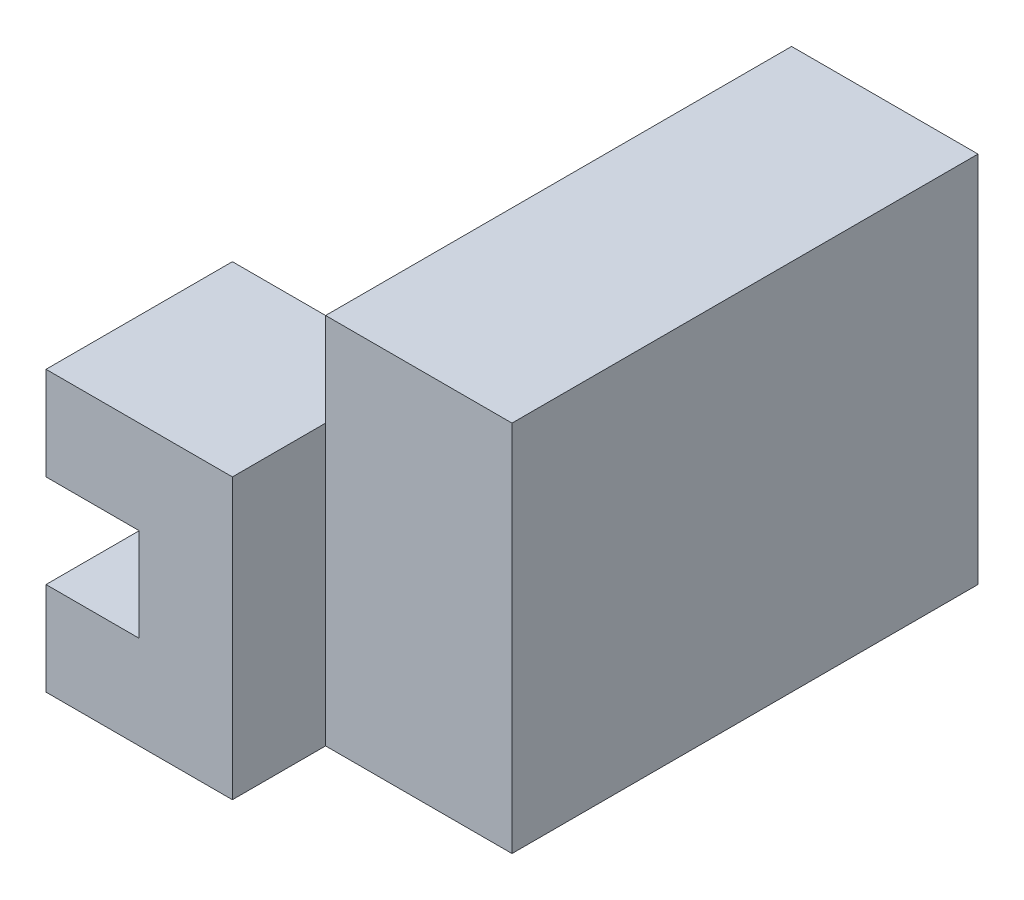
ISO-10303-21;
HEADER;
FILE_DESCRIPTION(('STEP AP214'),'2;1');
FILE_NAME('part.step','',(''),(''),'','','');
FILE_SCHEMA(('AUTOMOTIVE_DESIGN { 1 0 10303 214 1 1 1 1 }'));
ENDSEC;
DATA;
#1=APPLICATION_CONTEXT('core data for automotive mechanical design processes');
#2=APPLICATION_PROTOCOL_DEFINITION('international standard','automotive_design',2000,#1);
#3=PRODUCT_CONTEXT('',#1,'mechanical');
#4=PRODUCT('Part','Part','',(#3));
#5=PRODUCT_RELATED_PRODUCT_CATEGORY('part','',(#4));
#6=PRODUCT_DEFINITION_FORMATION('','',#4);
#7=PRODUCT_DEFINITION_CONTEXT('part definition',#1,'design');
#8=PRODUCT_DEFINITION('design','',#6,#7);
#9=PRODUCT_DEFINITION_SHAPE('','',#8);
#10=(LENGTH_UNIT() NAMED_UNIT(*) SI_UNIT(.MILLI.,.METRE.));
#11=(NAMED_UNIT(*) PLANE_ANGLE_UNIT() SI_UNIT($,.RADIAN.));
#12=(NAMED_UNIT(*) SI_UNIT($,.STERADIAN.) SOLID_ANGLE_UNIT());
#13=UNCERTAINTY_MEASURE_WITH_UNIT(LENGTH_MEASURE(1.E-05),#10,'distance_accuracy_value','');
#14=(GEOMETRIC_REPRESENTATION_CONTEXT(3) GLOBAL_UNCERTAINTY_ASSIGNED_CONTEXT((#13)) GLOBAL_UNIT_ASSIGNED_CONTEXT((#10,
#11,#12)) REPRESENTATION_CONTEXT('',''));
#15=CARTESIAN_POINT('',(0.,0.,0.));
#16=DIRECTION('',(0.,0.,1.));
#17=DIRECTION('',(1.,0.,0.));
#18=AXIS2_PLACEMENT_3D('',#15,#16,#17);
#19=CARTESIAN_POINT('',(0.,4.,5.));
#20=DIRECTION('',(1.,0.,0.));
#21=DIRECTION('',(0.,0.,-1.));
#22=AXIS2_PLACEMENT_3D('',#19,#20,#21);
#23=PLANE('',#22);
#24=DIRECTION('',(0.,0.,-1.));
#25=VECTOR('',#24,1.);
#26=CARTESIAN_POINT('',(0.,3.,6.));
#27=LINE('',#26,#25);
#28=CARTESIAN_POINT('',(0.,3.,5.));
#29=VERTEX_POINT('',#28);
#30=CARTESIAN_POINT('',(0.,3.,4.));
#31=VERTEX_POINT('',#30);
#32=EDGE_CURVE('E180',#29,#31,#27,.T.);
#33=ORIENTED_EDGE('',*,*,#32,.F.);
#34=DIRECTION('',(0.,-1.,0.));
#35=VECTOR('',#34,1.);
#36=CARTESIAN_POINT('',(0.,4.,5.));
#37=LINE('',#36,#35);
#38=CARTESIAN_POINT('',(0.,4.,5.));
#39=VERTEX_POINT('',#38);
#40=EDGE_CURVE('E194',#39,#29,#37,.T.);
#41=ORIENTED_EDGE('',*,*,#40,.F.);
#42=DIRECTION('',(0.,0.,-1.));
#43=VECTOR('',#42,1.);
#44=CARTESIAN_POINT('',(0.,4.,5.));
#45=LINE('',#44,#43);
#46=CARTESIAN_POINT('',(0.,4.,0.));
#47=VERTEX_POINT('',#46);
#48=EDGE_CURVE('E203',#39,#47,#45,.T.);
#49=ORIENTED_EDGE('',*,*,#48,.T.);
#50=DIRECTION('',(0.,-1.,0.));
#51=VECTOR('',#50,1.);
#52=CARTESIAN_POINT('',(0.,4.,0.));
#53=LINE('',#52,#51);
#54=CARTESIAN_POINT('',(0.,1.,0.));
#55=VERTEX_POINT('',#54);
#56=EDGE_CURVE('E193',#47,#55,#53,.T.);
#57=ORIENTED_EDGE('',*,*,#56,.T.);
#58=DIRECTION('',(0.,0.,1.));
#59=VECTOR('',#58,1.);
#60=CARTESIAN_POINT('',(0.,1.,0.));
#61=LINE('',#60,#59);
#62=CARTESIAN_POINT('',(0.,1.,4.));
#63=VERTEX_POINT('',#62);
#64=EDGE_CURVE('E135',#55,#63,#61,.T.);
#65=ORIENTED_EDGE('',*,*,#64,.T.);
#66=DIRECTION('',(0.,1.,0.));
#67=VECTOR('',#66,1.);
#68=CARTESIAN_POINT('',(0.,3.,4.));
#69=LINE('',#68,#67);
#70=EDGE_CURVE('E47',#63,#31,#69,.T.);
#71=ORIENTED_EDGE('',*,*,#70,.T.);
#72=EDGE_LOOP('',(#33,#41,#49,#57,#65,#71));
#73=FACE_BOUND('',#72,.T.);
#74=ADVANCED_FACE('F33',(#73),#23,.F.);
#75=CARTESIAN_POINT('',(0.,0.,5.));
#76=DIRECTION('',(0.,0.,1.));
#77=DIRECTION('',(1.,0.,0.));
#78=AXIS2_PLACEMENT_3D('',#75,#76,#77);
#79=PLANE('',#78);
#80=DIRECTION('',(0.,-1.,0.));
#81=VECTOR('',#80,1.);
#82=CARTESIAN_POINT('',(0.,0.,5.));
#83=LINE('',#82,#81);
#84=CARTESIAN_POINT('',(0.,0.,5.));
#85=VERTEX_POINT('',#84);
#86=EDGE_CURVE('E55',#29,#85,#83,.T.);
#87=ORIENTED_EDGE('',*,*,#86,.T.);
#88=DIRECTION('',(1.,0.,0.));
#89=VECTOR('',#88,1.);
#90=CARTESIAN_POINT('',(0.,0.,5.));
#91=LINE('',#90,#89);
#92=CARTESIAN_POINT('',(2.,0.,5.));
#93=VERTEX_POINT('',#92);
#94=EDGE_CURVE('E196',#85,#93,#91,.T.);
#95=ORIENTED_EDGE('',*,*,#94,.T.);
#96=DIRECTION('',(0.,1.,0.));
#97=VECTOR('',#96,1.);
#98=CARTESIAN_POINT('',(2.,0.,5.));
#99=LINE('',#98,#97);
#100=CARTESIAN_POINT('',(2.,4.,5.));
#101=VERTEX_POINT('',#100);
#102=EDGE_CURVE('E199',#93,#101,#99,.T.);
#103=ORIENTED_EDGE('',*,*,#102,.T.);
#104=DIRECTION('',(-1.,0.,0.));
#105=VECTOR('',#104,1.);
#106=CARTESIAN_POINT('',(2.,4.,5.));
#107=LINE('',#106,#105);
#108=EDGE_CURVE('E201',#101,#39,#107,.T.);
#109=ORIENTED_EDGE('',*,*,#108,.T.);
#110=ORIENTED_EDGE('',*,*,#40,.T.);
#111=EDGE_LOOP('',(#87,#95,#103,#109,#110));
#112=FACE_BOUND('',#111,.T.);
#113=ADVANCED_FACE('F241',(#112),#79,.T.);
#114=CARTESIAN_POINT('',(0.,1.,0.));
#115=DIRECTION('',(0.,-1.,0.));
#116=DIRECTION('',(0.,0.,-1.));
#117=AXIS2_PLACEMENT_3D('',#114,#115,#116);
#118=PLANE('',#117);
#119=DIRECTION('',(-1.,0.,0.));
#120=VECTOR('',#119,1.);
#121=CARTESIAN_POINT('',(0.,1.,4.));
#122=LINE('',#121,#120);
#123=CARTESIAN_POINT('',(-1.,1.,4.));
#124=VERTEX_POINT('',#123);
#125=EDGE_CURVE('E40',#63,#124,#122,.T.);
#126=ORIENTED_EDGE('',*,*,#125,.F.);
#127=ORIENTED_EDGE('',*,*,#64,.F.);
#128=DIRECTION('',(1.,0.,0.));
#129=VECTOR('',#128,1.);
#130=CARTESIAN_POINT('',(0.,1.,0.));
#131=LINE('',#130,#129);
#132=CARTESIAN_POINT('',(-2.,1.,0.));
#133=VERTEX_POINT('',#132);
#134=EDGE_CURVE('E131',#133,#55,#131,.T.);
#135=ORIENTED_EDGE('',*,*,#134,.F.);
#136=DIRECTION('',(0.,0.,-1.));
#137=VECTOR('',#136,1.);
#138=CARTESIAN_POINT('',(-2.,1.,0.));
#139=LINE('',#138,#137);
#140=CARTESIAN_POINT('',(-2.,1.,6.));
#141=VERTEX_POINT('',#140);
#142=EDGE_CURVE('E125',#141,#133,#139,.T.);
#143=ORIENTED_EDGE('',*,*,#142,.F.);
#144=DIRECTION('',(-1.,0.,0.));
#145=VECTOR('',#144,1.);
#146=CARTESIAN_POINT('',(-2.,1.,6.));
#147=LINE('',#146,#145);
#148=CARTESIAN_POINT('',(-1.,1.,6.));
#149=VERTEX_POINT('',#148);
#150=EDGE_CURVE('E129',#149,#141,#147,.T.);
#151=ORIENTED_EDGE('',*,*,#150,.F.);
#152=DIRECTION('',(0.,0.,1.));
#153=VECTOR('',#152,1.);
#154=CARTESIAN_POINT('',(-1.,1.,0.));
#155=LINE('',#154,#153);
#156=EDGE_CURVE('E11',#124,#149,#155,.T.);
#157=ORIENTED_EDGE('',*,*,#156,.F.);
#158=EDGE_LOOP('',(#126,#127,#135,#143,#151,#157));
#159=FACE_BOUND('',#158,.T.);
#160=ADVANCED_FACE('F127',(#159),#118,.F.);
#161=CARTESIAN_POINT('',(0.,0.,5.));
#162=DIRECTION('',(0.,1.,0.));
#163=DIRECTION('',(0.,0.,1.));
#164=AXIS2_PLACEMENT_3D('',#161,#162,#163);
#165=PLANE('',#164);
#166=ORIENTED_EDGE('',*,*,#94,.F.);
#167=DIRECTION('',(0.,0.,-1.));
#168=VECTOR('',#167,1.);
#169=CARTESIAN_POINT('',(0.,0.,6.));
#170=LINE('',#169,#168);
#171=CARTESIAN_POINT('',(0.,0.,6.));
#172=VERTEX_POINT('',#171);
#173=EDGE_CURVE('E184',#172,#85,#170,.T.);
#174=ORIENTED_EDGE('',*,*,#173,.F.);
#175=DIRECTION('',(1.,0.,0.));
#176=VECTOR('',#175,1.);
#177=CARTESIAN_POINT('',(0.,0.,6.));
#178=LINE('',#177,#176);
#179=CARTESIAN_POINT('',(-2.,0.,6.));
#180=VERTEX_POINT('',#179);
#181=EDGE_CURVE('E143',#180,#172,#178,.T.);
#182=ORIENTED_EDGE('',*,*,#181,.F.);
#183=DIRECTION('',(0.,0.,-1.));
#184=VECTOR('',#183,1.);
#185=CARTESIAN_POINT('',(-2.,0.,0.));
#186=LINE('',#185,#184);
#187=CARTESIAN_POINT('',(-2.,0.,0.));
#188=VERTEX_POINT('',#187);
#189=EDGE_CURVE('E140',#180,#188,#186,.T.);
#190=ORIENTED_EDGE('',*,*,#189,.T.);
#191=DIRECTION('',(1.,0.,0.));
#192=VECTOR('',#191,1.);
#193=CARTESIAN_POINT('',(0.,0.,0.));
#194=LINE('',#193,#192);
#195=CARTESIAN_POINT('',(2.,0.,0.));
#196=VERTEX_POINT('',#195);
#197=EDGE_CURVE('E206',#188,#196,#194,.T.);
#198=ORIENTED_EDGE('',*,*,#197,.T.);
#199=DIRECTION('',(0.,0.,-1.));
#200=VECTOR('',#199,1.);
#201=CARTESIAN_POINT('',(2.,0.,5.));
#202=LINE('',#201,#200);
#203=EDGE_CURVE('E216',#93,#196,#202,.T.);
#204=ORIENTED_EDGE('',*,*,#203,.F.);
#205=EDGE_LOOP('',(#166,#174,#182,#190,#198,#204));
#206=FACE_BOUND('',#205,.T.);
#207=ADVANCED_FACE('F249',(#206),#165,.F.);
#208=CARTESIAN_POINT('',(2.,0.,5.));
#209=DIRECTION('',(-1.,0.,0.));
#210=DIRECTION('',(0.,0.,1.));
#211=AXIS2_PLACEMENT_3D('',#208,#209,#210);
#212=PLANE('',#211);
#213=DIRECTION('',(0.,1.,0.));
#214=VECTOR('',#213,1.);
#215=CARTESIAN_POINT('',(2.,0.,0.));
#216=LINE('',#215,#214);
#217=CARTESIAN_POINT('',(2.,4.,0.));
#218=VERTEX_POINT('',#217);
#219=EDGE_CURVE('E208',#196,#218,#216,.T.);
#220=ORIENTED_EDGE('',*,*,#219,.T.);
#221=DIRECTION('',(0.,0.,-1.));
#222=VECTOR('',#221,1.);
#223=CARTESIAN_POINT('',(2.,4.,5.));
#224=LINE('',#223,#222);
#225=EDGE_CURVE('E213',#101,#218,#224,.T.);
#226=ORIENTED_EDGE('',*,*,#225,.F.);
#227=ORIENTED_EDGE('',*,*,#102,.F.);
#228=ORIENTED_EDGE('',*,*,#203,.T.);
#229=EDGE_LOOP('',(#220,#226,#227,#228));
#230=FACE_BOUND('',#229,.T.);
#231=ADVANCED_FACE('F254',(#230),#212,.F.);
#232=CARTESIAN_POINT('',(2.,4.,5.));
#233=DIRECTION('',(0.,-1.,0.));
#234=DIRECTION('',(0.,0.,-1.));
#235=AXIS2_PLACEMENT_3D('',#232,#233,#234);
#236=PLANE('',#235);
#237=DIRECTION('',(-1.,0.,0.));
#238=VECTOR('',#237,1.);
#239=CARTESIAN_POINT('',(2.,4.,0.));
#240=LINE('',#239,#238);
#241=EDGE_CURVE('E197',#218,#47,#240,.T.);
#242=ORIENTED_EDGE('',*,*,#241,.T.);
#243=ORIENTED_EDGE('',*,*,#48,.F.);
#244=ORIENTED_EDGE('',*,*,#108,.F.);
#245=ORIENTED_EDGE('',*,*,#225,.T.);
#246=EDGE_LOOP('',(#242,#243,#244,#245));
#247=FACE_BOUND('',#246,.T.);
#248=ADVANCED_FACE('F258',(#247),#236,.F.);
#249=CARTESIAN_POINT('',(0.,0.,0.));
#250=DIRECTION('',(0.,0.,1.));
#251=DIRECTION('',(1.,0.,0.));
#252=AXIS2_PLACEMENT_3D('',#249,#250,#251);
#253=PLANE('',#252);
#254=ORIENTED_EDGE('',*,*,#56,.F.);
#255=ORIENTED_EDGE('',*,*,#241,.F.);
#256=ORIENTED_EDGE('',*,*,#219,.F.);
#257=ORIENTED_EDGE('',*,*,#197,.F.);
#258=DIRECTION('',(0.,-1.,0.));
#259=VECTOR('',#258,1.);
#260=CARTESIAN_POINT('',(-2.,1.,0.));
#261=LINE('',#260,#259);
#262=EDGE_CURVE('E190',#133,#188,#261,.T.);
#263=ORIENTED_EDGE('',*,*,#262,.F.);
#264=ORIENTED_EDGE('',*,*,#134,.T.);
#265=EDGE_LOOP('',(#254,#255,#256,#257,#263,#264));
#266=FACE_BOUND('',#265,.T.);
#267=ADVANCED_FACE('F261',(#266),#253,.F.);
#268=CARTESIAN_POINT('',(-2.,1.,0.));
#269=DIRECTION('',(-1.,0.,0.));
#270=DIRECTION('',(0.,0.,1.));
#271=AXIS2_PLACEMENT_3D('',#268,#269,#270);
#272=PLANE('',#271);
#273=ORIENTED_EDGE('',*,*,#142,.T.);
#274=ORIENTED_EDGE('',*,*,#262,.T.);
#275=ORIENTED_EDGE('',*,*,#189,.F.);
#276=DIRECTION('',(0.,-1.,0.));
#277=VECTOR('',#276,1.);
#278=CARTESIAN_POINT('',(-2.,0.,6.));
#279=LINE('',#278,#277);
#280=EDGE_CURVE('E138',#141,#180,#279,.T.);
#281=ORIENTED_EDGE('',*,*,#280,.F.);
#282=EDGE_LOOP('',(#273,#274,#275,#281));
#283=FACE_BOUND('',#282,.T.);
#284=ADVANCED_FACE('F139',(#283),#272,.T.);
#285=CARTESIAN_POINT('',(0.,0.,4.));
#286=DIRECTION('',(0.,0.,1.));
#287=DIRECTION('',(1.,0.,0.));
#288=AXIS2_PLACEMENT_3D('',#285,#286,#287);
#289=PLANE('',#288);
#290=ORIENTED_EDGE('',*,*,#70,.F.);
#291=ORIENTED_EDGE('',*,*,#125,.T.);
#292=DIRECTION('',(0.,-1.,0.));
#293=VECTOR('',#292,1.);
#294=CARTESIAN_POINT('',(-1.,1.,4.));
#295=LINE('',#294,#293);
#296=CARTESIAN_POINT('',(-1.,2.,4.));
#297=VERTEX_POINT('',#296);
#298=EDGE_CURVE('E149',#297,#124,#295,.T.);
#299=ORIENTED_EDGE('',*,*,#298,.F.);
#300=DIRECTION('',(1.,0.,0.));
#301=VECTOR('',#300,1.);
#302=CARTESIAN_POINT('',(-1.,2.,4.));
#303=LINE('',#302,#301);
#304=CARTESIAN_POINT('',(-2.,2.,4.));
#305=VERTEX_POINT('',#304);
#306=EDGE_CURVE('E152',#305,#297,#303,.T.);
#307=ORIENTED_EDGE('',*,*,#306,.F.);
#308=DIRECTION('',(0.,-1.,0.));
#309=VECTOR('',#308,1.);
#310=CARTESIAN_POINT('',(-2.,2.,4.));
#311=LINE('',#310,#309);
#312=CARTESIAN_POINT('',(-2.,3.,4.));
#313=VERTEX_POINT('',#312);
#314=EDGE_CURVE('E169',#313,#305,#311,.T.);
#315=ORIENTED_EDGE('',*,*,#314,.F.);
#316=DIRECTION('',(-1.,0.,0.));
#317=VECTOR('',#316,1.);
#318=CARTESIAN_POINT('',(-2.,3.,4.));
#319=LINE('',#318,#317);
#320=EDGE_CURVE('E167',#31,#313,#319,.T.);
#321=ORIENTED_EDGE('',*,*,#320,.F.);
#322=EDGE_LOOP('',(#290,#291,#299,#307,#315,#321));
#323=FACE_BOUND('',#322,.T.);
#324=ADVANCED_FACE('F221',(#323),#289,.F.);
#325=CARTESIAN_POINT('',(0.,3.,6.));
#326=DIRECTION('',(-1.,0.,0.));
#327=DIRECTION('',(0.,0.,1.));
#328=AXIS2_PLACEMENT_3D('',#325,#326,#327);
#329=PLANE('',#328);
#330=ORIENTED_EDGE('',*,*,#86,.F.);
#331=CARTESIAN_POINT('',(0.,3.,6.));
#332=VERTEX_POINT('',#331);
#333=EDGE_CURVE('E181',#332,#29,#27,.T.);
#334=ORIENTED_EDGE('',*,*,#333,.F.);
#335=DIRECTION('',(0.,1.,0.));
#336=VECTOR('',#335,1.);
#337=CARTESIAN_POINT('',(0.,3.,6.));
#338=LINE('',#337,#336);
#339=EDGE_CURVE('E156',#172,#332,#338,.T.);
#340=ORIENTED_EDGE('',*,*,#339,.F.);
#341=ORIENTED_EDGE('',*,*,#173,.T.);
#342=EDGE_LOOP('',(#330,#334,#340,#341));
#343=FACE_BOUND('',#342,.T.);
#344=ADVANCED_FACE('F245',(#343),#329,.F.);
#345=CARTESIAN_POINT('',(-2.,3.,6.));
#346=DIRECTION('',(0.,-1.,0.));
#347=DIRECTION('',(0.,0.,-1.));
#348=AXIS2_PLACEMENT_3D('',#345,#346,#347);
#349=PLANE('',#348);
#350=ORIENTED_EDGE('',*,*,#320,.T.);
#351=DIRECTION('',(0.,0.,-1.));
#352=VECTOR('',#351,1.);
#353=CARTESIAN_POINT('',(-2.,3.,6.));
#354=LINE('',#353,#352);
#355=CARTESIAN_POINT('',(-2.,3.,6.));
#356=VERTEX_POINT('',#355);
#357=EDGE_CURVE('E177',#356,#313,#354,.T.);
#358=ORIENTED_EDGE('',*,*,#357,.F.);
#359=DIRECTION('',(-1.,0.,0.));
#360=VECTOR('',#359,1.);
#361=CARTESIAN_POINT('',(-2.,3.,6.));
#362=LINE('',#361,#360);
#363=EDGE_CURVE('E158',#332,#356,#362,.T.);
#364=ORIENTED_EDGE('',*,*,#363,.F.);
#365=ORIENTED_EDGE('',*,*,#333,.T.);
#366=ORIENTED_EDGE('',*,*,#32,.T.);
#367=EDGE_LOOP('',(#350,#358,#364,#365,#366));
#368=FACE_BOUND('',#367,.T.);
#369=ADVANCED_FACE('F238',(#368),#349,.F.);
#370=CARTESIAN_POINT('',(-2.,2.,6.));
#371=DIRECTION('',(1.,0.,0.));
#372=DIRECTION('',(0.,0.,-1.));
#373=AXIS2_PLACEMENT_3D('',#370,#371,#372);
#374=PLANE('',#373);
#375=ORIENTED_EDGE('',*,*,#314,.T.);
#376=DIRECTION('',(0.,0.,-1.));
#377=VECTOR('',#376,1.);
#378=CARTESIAN_POINT('',(-2.,2.,6.));
#379=LINE('',#378,#377);
#380=CARTESIAN_POINT('',(-2.,2.,6.));
#381=VERTEX_POINT('',#380);
#382=EDGE_CURVE('E174',#381,#305,#379,.T.);
#383=ORIENTED_EDGE('',*,*,#382,.F.);
#384=DIRECTION('',(0.,-1.,0.));
#385=VECTOR('',#384,1.);
#386=CARTESIAN_POINT('',(-2.,2.,6.));
#387=LINE('',#386,#385);
#388=EDGE_CURVE('E160',#356,#381,#387,.T.);
#389=ORIENTED_EDGE('',*,*,#388,.F.);
#390=ORIENTED_EDGE('',*,*,#357,.T.);
#391=EDGE_LOOP('',(#375,#383,#389,#390));
#392=FACE_BOUND('',#391,.T.);
#393=ADVANCED_FACE('F233',(#392),#374,.F.);
#394=CARTESIAN_POINT('',(-1.,2.,6.));
#395=DIRECTION('',(0.,1.,0.));
#396=DIRECTION('',(0.,0.,1.));
#397=AXIS2_PLACEMENT_3D('',#394,#395,#396);
#398=PLANE('',#397);
#399=ORIENTED_EDGE('',*,*,#306,.T.);
#400=DIRECTION('',(0.,0.,-1.));
#401=VECTOR('',#400,1.);
#402=CARTESIAN_POINT('',(-1.,2.,6.));
#403=LINE('',#402,#401);
#404=CARTESIAN_POINT('',(-1.,2.,6.));
#405=VERTEX_POINT('',#404);
#406=EDGE_CURVE('E165',#405,#297,#403,.T.);
#407=ORIENTED_EDGE('',*,*,#406,.F.);
#408=DIRECTION('',(1.,0.,0.));
#409=VECTOR('',#408,1.);
#410=CARTESIAN_POINT('',(-1.,2.,6.));
#411=LINE('',#410,#409);
#412=EDGE_CURVE('E162',#381,#405,#411,.T.);
#413=ORIENTED_EDGE('',*,*,#412,.F.);
#414=ORIENTED_EDGE('',*,*,#382,.T.);
#415=EDGE_LOOP('',(#399,#407,#413,#414));
#416=FACE_BOUND('',#415,.T.);
#417=ADVANCED_FACE('F229',(#416),#398,.F.);
#418=CARTESIAN_POINT('',(-1.,1.,6.));
#419=DIRECTION('',(1.,0.,0.));
#420=DIRECTION('',(0.,0.,-1.));
#421=AXIS2_PLACEMENT_3D('',#418,#419,#420);
#422=PLANE('',#421);
#423=ORIENTED_EDGE('',*,*,#298,.T.);
#424=ORIENTED_EDGE('',*,*,#156,.T.);
#425=DIRECTION('',(0.,-1.,0.));
#426=VECTOR('',#425,1.);
#427=CARTESIAN_POINT('',(-1.,1.,6.));
#428=LINE('',#427,#426);
#429=EDGE_CURVE('E148',#405,#149,#428,.T.);
#430=ORIENTED_EDGE('',*,*,#429,.F.);
#431=ORIENTED_EDGE('',*,*,#406,.T.);
#432=EDGE_LOOP('',(#423,#424,#430,#431));
#433=FACE_BOUND('',#432,.T.);
#434=ADVANCED_FACE('F225',(#433),#422,.F.);
#435=CARTESIAN_POINT('',(0.,0.,6.));
#436=DIRECTION('',(0.,0.,1.));
#437=DIRECTION('',(1.,0.,0.));
#438=AXIS2_PLACEMENT_3D('',#435,#436,#437);
#439=PLANE('',#438);
#440=ORIENTED_EDGE('',*,*,#150,.T.);
#441=ORIENTED_EDGE('',*,*,#280,.T.);
#442=ORIENTED_EDGE('',*,*,#181,.T.);
#443=ORIENTED_EDGE('',*,*,#339,.T.);
#444=ORIENTED_EDGE('',*,*,#363,.T.);
#445=ORIENTED_EDGE('',*,*,#388,.T.);
#446=ORIENTED_EDGE('',*,*,#412,.T.);
#447=ORIENTED_EDGE('',*,*,#429,.T.);
#448=EDGE_LOOP('',(#440,#441,#442,#443,#444,#445,#446,#447));
#449=FACE_BOUND('',#448,.T.);
#450=ADVANCED_FACE('F146',(#449),#439,.T.);
#451=CLOSED_SHELL('',(#74,#113,#160,#207,#231,#248,#267,#284,#324,#344,#369,#393,#417,#434,#450));
#452=MANIFOLD_SOLID_BREP('B2',#451);
#453=ADVANCED_BREP_SHAPE_REPRESENTATION('',(#18,#452),#14);
#454=SHAPE_DEFINITION_REPRESENTATION(#9,#453);
ENDSEC;
END-ISO-10303-21;
